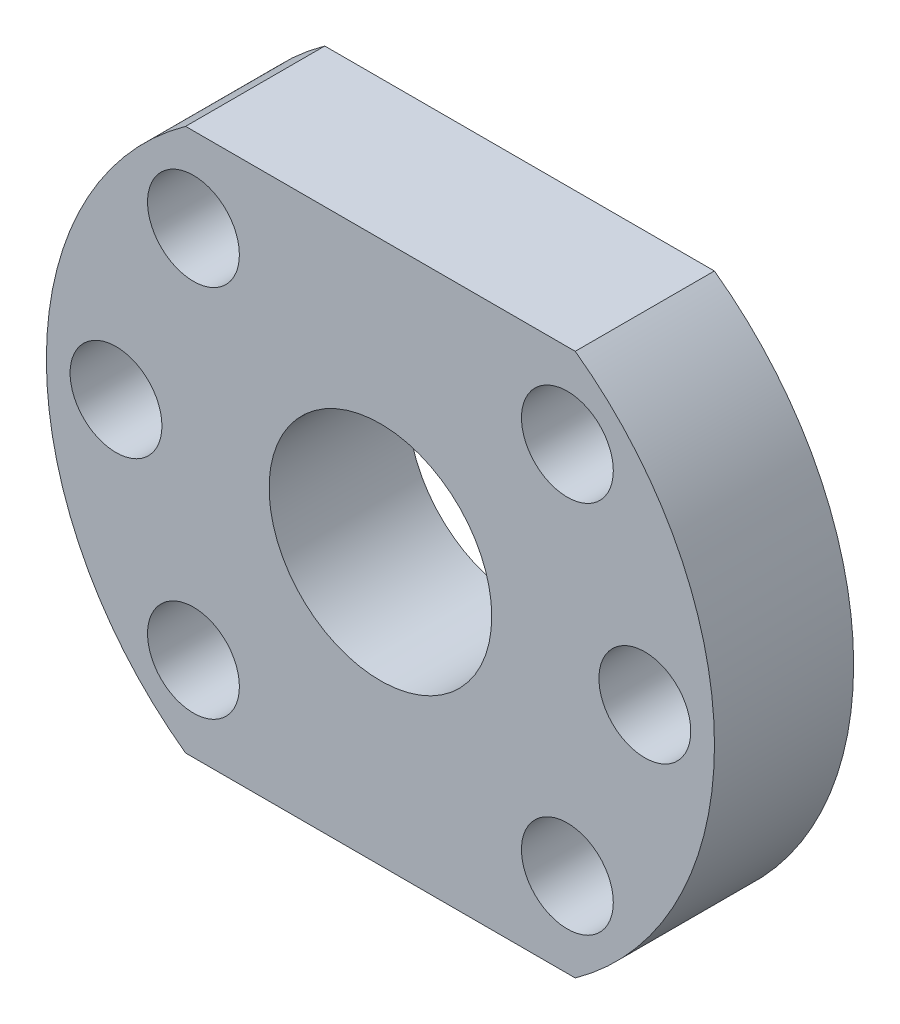
ISO-10303-21;
HEADER;
FILE_DESCRIPTION(('STEP AP214'),'2;1');
FILE_NAME('part.step','',(''),(''),'','','');
FILE_SCHEMA(('AUTOMOTIVE_DESIGN { 1 0 10303 214 1 1 1 1 }'));
ENDSEC;
DATA;
#1=APPLICATION_CONTEXT('core data for automotive mechanical design processes');
#2=APPLICATION_PROTOCOL_DEFINITION('international standard','automotive_design',2000,#1);
#3=PRODUCT_CONTEXT('',#1,'mechanical');
#4=PRODUCT('Part','Part','',(#3));
#5=PRODUCT_RELATED_PRODUCT_CATEGORY('part','',(#4));
#6=PRODUCT_DEFINITION_FORMATION('','',#4);
#7=PRODUCT_DEFINITION_CONTEXT('part definition',#1,'design');
#8=PRODUCT_DEFINITION('design','',#6,#7);
#9=PRODUCT_DEFINITION_SHAPE('','',#8);
#10=(LENGTH_UNIT() NAMED_UNIT(*) SI_UNIT(.MILLI.,.METRE.));
#11=(NAMED_UNIT(*) PLANE_ANGLE_UNIT() SI_UNIT($,.RADIAN.));
#12=(NAMED_UNIT(*) SI_UNIT($,.STERADIAN.) SOLID_ANGLE_UNIT());
#13=UNCERTAINTY_MEASURE_WITH_UNIT(LENGTH_MEASURE(1.E-05),#10,'distance_accuracy_value','');
#14=(GEOMETRIC_REPRESENTATION_CONTEXT(3) GLOBAL_UNCERTAINTY_ASSIGNED_CONTEXT((#13)) GLOBAL_UNIT_ASSIGNED_CONTEXT((#10,
#11,#12)) REPRESENTATION_CONTEXT('',''));
#15=CARTESIAN_POINT('',(0.,0.,0.));
#16=DIRECTION('',(0.,0.,1.));
#17=DIRECTION('',(1.,0.,0.));
#18=AXIS2_PLACEMENT_3D('',#15,#16,#17);
#19=CARTESIAN_POINT('',(0.,0.,10.));
#20=DIRECTION('',(0.,0.,1.));
#21=DIRECTION('',(1.,0.,0.));
#22=AXIS2_PLACEMENT_3D('',#19,#20,#21);
#23=PLANE('',#22);
#24=CARTESIAN_POINT('',(-13.4350288425444,13.4350288425444,10.));
#25=DIRECTION('',(0.,0.,1.));
#26=DIRECTION('',(1.,0.,0.));
#27=AXIS2_PLACEMENT_3D('',#24,#25,#26);
#28=CIRCLE('',#27,3.3);
#29=CARTESIAN_POINT('',(-10.1350288425444,13.4350288425444,10.));
#30=VERTEX_POINT('',#29);
#31=EDGE_CURVE('E181',#30,#30,#28,.T.);
#32=ORIENTED_EDGE('',*,*,#31,.F.);
#33=EDGE_LOOP('',(#32));
#34=FACE_BOUND('',#33,.T.);
#35=CARTESIAN_POINT('',(13.4350288425444,13.4350288425444,10.));
#36=DIRECTION('',(0.,0.,1.));
#37=DIRECTION('',(1.,0.,0.));
#38=AXIS2_PLACEMENT_3D('',#35,#36,#37);
#39=CIRCLE('',#38,3.3);
#40=CARTESIAN_POINT('',(16.7350288425444,13.4350288425444,10.));
#41=VERTEX_POINT('',#40);
#42=EDGE_CURVE('E173',#41,#41,#39,.T.);
#43=ORIENTED_EDGE('',*,*,#42,.F.);
#44=EDGE_LOOP('',(#43));
#45=FACE_BOUND('',#44,.T.);
#46=CARTESIAN_POINT('',(19.,0.,10.));
#47=DIRECTION('',(0.,0.,1.));
#48=DIRECTION('',(1.,0.,0.));
#49=AXIS2_PLACEMENT_3D('',#46,#47,#48);
#50=CIRCLE('',#49,3.3);
#51=CARTESIAN_POINT('',(22.3,0.,10.));
#52=VERTEX_POINT('',#51);
#53=EDGE_CURVE('E165',#52,#52,#50,.T.);
#54=ORIENTED_EDGE('',*,*,#53,.F.);
#55=EDGE_LOOP('',(#54));
#56=FACE_BOUND('',#55,.T.);
#57=CARTESIAN_POINT('',(13.4350288425444,-13.4350288425444,10.));
#58=DIRECTION('',(0.,0.,1.));
#59=DIRECTION('',(1.,0.,0.));
#60=AXIS2_PLACEMENT_3D('',#57,#58,#59);
#61=CIRCLE('',#60,3.3);
#62=CARTESIAN_POINT('',(16.7350288425444,-13.4350288425444,10.));
#63=VERTEX_POINT('',#62);
#64=EDGE_CURVE('E157',#63,#63,#61,.T.);
#65=ORIENTED_EDGE('',*,*,#64,.F.);
#66=EDGE_LOOP('',(#65));
#67=FACE_BOUND('',#66,.T.);
#68=CARTESIAN_POINT('',(-13.4350288425444,-13.4350288425444,10.));
#69=DIRECTION('',(0.,0.,1.));
#70=DIRECTION('',(1.,0.,0.));
#71=AXIS2_PLACEMENT_3D('',#68,#69,#70);
#72=CIRCLE('',#71,3.3);
#73=CARTESIAN_POINT('',(-10.1350288425444,-13.4350288425444,10.));
#74=VERTEX_POINT('',#73);
#75=EDGE_CURVE('E149',#74,#74,#72,.T.);
#76=ORIENTED_EDGE('',*,*,#75,.F.);
#77=EDGE_LOOP('',(#76));
#78=FACE_BOUND('',#77,.T.);
#79=CARTESIAN_POINT('',(-19.,0.,10.));
#80=DIRECTION('',(0.,0.,1.));
#81=DIRECTION('',(1.,0.,0.));
#82=AXIS2_PLACEMENT_3D('',#79,#80,#81);
#83=CIRCLE('',#82,3.3);
#84=CARTESIAN_POINT('',(-15.7,0.,10.));
#85=VERTEX_POINT('',#84);
#86=EDGE_CURVE('E141',#85,#85,#83,.T.);
#87=ORIENTED_EDGE('',*,*,#86,.F.);
#88=EDGE_LOOP('',(#87));
#89=FACE_BOUND('',#88,.T.);
#90=CARTESIAN_POINT('',(0.,0.,10.));
#91=DIRECTION('',(0.,0.,1.));
#92=DIRECTION('',(1.,0.,0.));
#93=AXIS2_PLACEMENT_3D('',#90,#91,#92);
#94=CIRCLE('',#93,24.0052077683156);
#95=CARTESIAN_POINT('',(-14.,19.5,10.));
#96=VERTEX_POINT('',#95);
#97=CARTESIAN_POINT('',(-14.,-19.5,10.));
#98=VERTEX_POINT('',#97);
#99=EDGE_CURVE('E92',#96,#98,#94,.T.);
#100=ORIENTED_EDGE('',*,*,#99,.T.);
#101=DIRECTION('',(1.,0.,0.));
#102=VECTOR('',#101,1.);
#103=CARTESIAN_POINT('',(14.,-19.5,10.));
#104=LINE('',#103,#102);
#105=CARTESIAN_POINT('',(14.,-19.5,10.));
#106=VERTEX_POINT('',#105);
#107=EDGE_CURVE('E87',#98,#106,#104,.T.);
#108=ORIENTED_EDGE('',*,*,#107,.T.);
#109=CARTESIAN_POINT('',(0.,0.,10.));
#110=DIRECTION('',(0.,0.,1.));
#111=DIRECTION('',(1.,0.,0.));
#112=AXIS2_PLACEMENT_3D('',#109,#110,#111);
#113=CIRCLE('',#112,24.0052077683156);
#114=CARTESIAN_POINT('',(14.,19.5,10.));
#115=VERTEX_POINT('',#114);
#116=EDGE_CURVE('E90',#106,#115,#113,.T.);
#117=ORIENTED_EDGE('',*,*,#116,.T.);
#118=DIRECTION('',(-1.,0.,0.));
#119=VECTOR('',#118,1.);
#120=CARTESIAN_POINT('',(-14.,19.5,10.));
#121=LINE('',#120,#119);
#122=EDGE_CURVE('E57',#115,#96,#121,.T.);
#123=ORIENTED_EDGE('',*,*,#122,.T.);
#124=EDGE_LOOP('',(#100,#108,#117,#123));
#125=FACE_BOUND('',#124,.T.);
#126=CARTESIAN_POINT('',(0.,0.,10.));
#127=DIRECTION('',(0.,0.,1.));
#128=DIRECTION('',(1.,0.,0.));
#129=AXIS2_PLACEMENT_3D('',#126,#127,#128);
#130=CIRCLE('',#129,8.);
#131=CARTESIAN_POINT('',(8.,0.,10.));
#132=VERTEX_POINT('',#131);
#133=EDGE_CURVE('E112',#132,#132,#130,.T.);
#134=ORIENTED_EDGE('',*,*,#133,.F.);
#135=EDGE_LOOP('',(#134));
#136=FACE_BOUND('',#135,.T.);
#137=ADVANCED_FACE('F39',(#34,#45,#56,#67,#78,#89,#125,#136),#23,.T.);
#138=CARTESIAN_POINT('',(0.,0.,0.));
#139=DIRECTION('',(0.,0.,1.));
#140=DIRECTION('',(1.,0.,0.));
#141=AXIS2_PLACEMENT_3D('',#138,#139,#140);
#142=PLANE('',#141);
#143=CARTESIAN_POINT('',(-13.4350288425444,13.4350288425444,0.));
#144=DIRECTION('',(0.,0.,1.));
#145=DIRECTION('',(1.,0.,0.));
#146=AXIS2_PLACEMENT_3D('',#143,#144,#145);
#147=CIRCLE('',#146,3.3);
#148=CARTESIAN_POINT('',(-10.1350288425444,13.4350288425444,0.));
#149=VERTEX_POINT('',#148);
#150=EDGE_CURVE('E177',#149,#149,#147,.T.);
#151=ORIENTED_EDGE('',*,*,#150,.T.);
#152=EDGE_LOOP('',(#151));
#153=FACE_BOUND('',#152,.T.);
#154=CARTESIAN_POINT('',(13.4350288425444,13.4350288425444,0.));
#155=DIRECTION('',(0.,0.,1.));
#156=DIRECTION('',(1.,0.,0.));
#157=AXIS2_PLACEMENT_3D('',#154,#155,#156);
#158=CIRCLE('',#157,3.3);
#159=CARTESIAN_POINT('',(16.7350288425444,13.4350288425444,0.));
#160=VERTEX_POINT('',#159);
#161=EDGE_CURVE('E169',#160,#160,#158,.T.);
#162=ORIENTED_EDGE('',*,*,#161,.T.);
#163=EDGE_LOOP('',(#162));
#164=FACE_BOUND('',#163,.T.);
#165=CARTESIAN_POINT('',(19.,0.,0.));
#166=DIRECTION('',(0.,0.,1.));
#167=DIRECTION('',(1.,0.,0.));
#168=AXIS2_PLACEMENT_3D('',#165,#166,#167);
#169=CIRCLE('',#168,3.3);
#170=CARTESIAN_POINT('',(22.3,0.,0.));
#171=VERTEX_POINT('',#170);
#172=EDGE_CURVE('E161',#171,#171,#169,.T.);
#173=ORIENTED_EDGE('',*,*,#172,.T.);
#174=EDGE_LOOP('',(#173));
#175=FACE_BOUND('',#174,.T.);
#176=CARTESIAN_POINT('',(13.4350288425444,-13.4350288425444,0.));
#177=DIRECTION('',(0.,0.,1.));
#178=DIRECTION('',(1.,0.,0.));
#179=AXIS2_PLACEMENT_3D('',#176,#177,#178);
#180=CIRCLE('',#179,3.3);
#181=CARTESIAN_POINT('',(16.7350288425444,-13.4350288425444,0.));
#182=VERTEX_POINT('',#181);
#183=EDGE_CURVE('E153',#182,#182,#180,.T.);
#184=ORIENTED_EDGE('',*,*,#183,.T.);
#185=EDGE_LOOP('',(#184));
#186=FACE_BOUND('',#185,.T.);
#187=CARTESIAN_POINT('',(-13.4350288425444,-13.4350288425444,0.));
#188=DIRECTION('',(0.,0.,1.));
#189=DIRECTION('',(1.,0.,0.));
#190=AXIS2_PLACEMENT_3D('',#187,#188,#189);
#191=CIRCLE('',#190,3.3);
#192=CARTESIAN_POINT('',(-10.1350288425444,-13.4350288425444,0.));
#193=VERTEX_POINT('',#192);
#194=EDGE_CURVE('E145',#193,#193,#191,.T.);
#195=ORIENTED_EDGE('',*,*,#194,.T.);
#196=EDGE_LOOP('',(#195));
#197=FACE_BOUND('',#196,.T.);
#198=CARTESIAN_POINT('',(-19.,0.,0.));
#199=DIRECTION('',(0.,0.,1.));
#200=DIRECTION('',(1.,0.,0.));
#201=AXIS2_PLACEMENT_3D('',#198,#199,#200);
#202=CIRCLE('',#201,3.3);
#203=CARTESIAN_POINT('',(-15.7,0.,0.));
#204=VERTEX_POINT('',#203);
#205=EDGE_CURVE('E134',#204,#204,#202,.T.);
#206=ORIENTED_EDGE('',*,*,#205,.T.);
#207=EDGE_LOOP('',(#206));
#208=FACE_BOUND('',#207,.T.);
#209=CARTESIAN_POINT('',(0.,0.,0.));
#210=DIRECTION('',(0.,0.,1.));
#211=DIRECTION('',(1.,0.,0.));
#212=AXIS2_PLACEMENT_3D('',#209,#210,#211);
#213=CIRCLE('',#212,24.0052077683156);
#214=CARTESIAN_POINT('',(-14.,19.5,0.));
#215=VERTEX_POINT('',#214);
#216=CARTESIAN_POINT('',(-14.,-19.5,0.));
#217=VERTEX_POINT('',#216);
#218=EDGE_CURVE('E108',#215,#217,#213,.T.);
#219=ORIENTED_EDGE('',*,*,#218,.F.);
#220=DIRECTION('',(-1.,0.,0.));
#221=VECTOR('',#220,1.);
#222=CARTESIAN_POINT('',(-14.,19.5,0.));
#223=LINE('',#222,#221);
#224=CARTESIAN_POINT('',(14.,19.5,0.));
#225=VERTEX_POINT('',#224);
#226=EDGE_CURVE('E80',#225,#215,#223,.T.);
#227=ORIENTED_EDGE('',*,*,#226,.F.);
#228=CARTESIAN_POINT('',(0.,0.,0.));
#229=DIRECTION('',(0.,0.,1.));
#230=DIRECTION('',(1.,0.,0.));
#231=AXIS2_PLACEMENT_3D('',#228,#229,#230);
#232=CIRCLE('',#231,24.0052077683156);
#233=CARTESIAN_POINT('',(14.,-19.5,0.));
#234=VERTEX_POINT('',#233);
#235=EDGE_CURVE('E74',#234,#225,#232,.T.);
#236=ORIENTED_EDGE('',*,*,#235,.F.);
#237=DIRECTION('',(1.,0.,0.));
#238=VECTOR('',#237,1.);
#239=CARTESIAN_POINT('',(14.,-19.5,0.));
#240=LINE('',#239,#238);
#241=EDGE_CURVE('E97',#217,#234,#240,.T.);
#242=ORIENTED_EDGE('',*,*,#241,.F.);
#243=EDGE_LOOP('',(#219,#227,#236,#242));
#244=FACE_BOUND('',#243,.T.);
#245=CARTESIAN_POINT('',(0.,0.,0.));
#246=DIRECTION('',(0.,0.,1.));
#247=DIRECTION('',(1.,0.,0.));
#248=AXIS2_PLACEMENT_3D('',#245,#246,#247);
#249=CIRCLE('',#248,8.);
#250=CARTESIAN_POINT('',(8.,0.,0.));
#251=VERTEX_POINT('',#250);
#252=EDGE_CURVE('E130',#251,#251,#249,.T.);
#253=ORIENTED_EDGE('',*,*,#252,.T.);
#254=EDGE_LOOP('',(#253));
#255=FACE_BOUND('',#254,.T.);
#256=ADVANCED_FACE('F125',(#153,#164,#175,#186,#197,#208,#244,#255),#142,.F.);
#257=CARTESIAN_POINT('',(0.,0.,10.));
#258=DIRECTION('',(0.,0.,-1.));
#259=DIRECTION('',(-1.,0.,0.));
#260=AXIS2_PLACEMENT_3D('',#257,#258,#259);
#261=CYLINDRICAL_SURFACE('',#260,24.0052077683156);
#262=ORIENTED_EDGE('',*,*,#218,.T.);
#263=DIRECTION('',(0.,0.,-1.));
#264=VECTOR('',#263,1.);
#265=CARTESIAN_POINT('',(-14.,-19.5,10.));
#266=LINE('',#265,#264);
#267=EDGE_CURVE('E11',#98,#217,#266,.T.);
#268=ORIENTED_EDGE('',*,*,#267,.F.);
#269=ORIENTED_EDGE('',*,*,#99,.F.);
#270=DIRECTION('',(0.,0.,-1.));
#271=VECTOR('',#270,1.);
#272=CARTESIAN_POINT('',(-14.,19.5,10.));
#273=LINE('',#272,#271);
#274=EDGE_CURVE('E104',#96,#215,#273,.T.);
#275=ORIENTED_EDGE('',*,*,#274,.T.);
#276=EDGE_LOOP('',(#262,#268,#269,#275));
#277=FACE_BOUND('',#276,.T.);
#278=ADVANCED_FACE('F41',(#277),#261,.T.);
#279=CARTESIAN_POINT('',(14.,-19.5,10.));
#280=DIRECTION('',(0.,1.,0.));
#281=DIRECTION('',(0.,0.,1.));
#282=AXIS2_PLACEMENT_3D('',#279,#280,#281);
#283=PLANE('',#282);
#284=ORIENTED_EDGE('',*,*,#241,.T.);
#285=DIRECTION('',(0.,0.,-1.));
#286=VECTOR('',#285,1.);
#287=CARTESIAN_POINT('',(14.,-19.5,10.));
#288=LINE('',#287,#286);
#289=EDGE_CURVE('E49',#106,#234,#288,.T.);
#290=ORIENTED_EDGE('',*,*,#289,.F.);
#291=ORIENTED_EDGE('',*,*,#107,.F.);
#292=ORIENTED_EDGE('',*,*,#267,.T.);
#293=EDGE_LOOP('',(#284,#290,#291,#292));
#294=FACE_BOUND('',#293,.T.);
#295=ADVANCED_FACE('F96',(#294),#283,.F.);
#296=CARTESIAN_POINT('',(0.,0.,10.));
#297=DIRECTION('',(0.,0.,-1.));
#298=DIRECTION('',(-1.,0.,0.));
#299=AXIS2_PLACEMENT_3D('',#296,#297,#298);
#300=CYLINDRICAL_SURFACE('',#299,24.0052077683156);
#301=ORIENTED_EDGE('',*,*,#235,.T.);
#302=DIRECTION('',(0.,0.,-1.));
#303=VECTOR('',#302,1.);
#304=CARTESIAN_POINT('',(14.,19.5,10.));
#305=LINE('',#304,#303);
#306=EDGE_CURVE('E99',#115,#225,#305,.T.);
#307=ORIENTED_EDGE('',*,*,#306,.F.);
#308=ORIENTED_EDGE('',*,*,#116,.F.);
#309=ORIENTED_EDGE('',*,*,#289,.T.);
#310=EDGE_LOOP('',(#301,#307,#308,#309));
#311=FACE_BOUND('',#310,.T.);
#312=ADVANCED_FACE('F100',(#311),#300,.T.);
#313=CARTESIAN_POINT('',(-14.,19.5,10.));
#314=DIRECTION('',(0.,-1.,0.));
#315=DIRECTION('',(0.,0.,-1.));
#316=AXIS2_PLACEMENT_3D('',#313,#314,#315);
#317=PLANE('',#316);
#318=ORIENTED_EDGE('',*,*,#226,.T.);
#319=ORIENTED_EDGE('',*,*,#274,.F.);
#320=ORIENTED_EDGE('',*,*,#122,.F.);
#321=ORIENTED_EDGE('',*,*,#306,.T.);
#322=EDGE_LOOP('',(#318,#319,#320,#321));
#323=FACE_BOUND('',#322,.T.);
#324=ADVANCED_FACE('F122',(#323),#317,.F.);
#325=CARTESIAN_POINT('',(0.,0.,10.));
#326=DIRECTION('',(0.,0.,-1.));
#327=DIRECTION('',(-1.,0.,0.));
#328=AXIS2_PLACEMENT_3D('',#325,#326,#327);
#329=CYLINDRICAL_SURFACE('',#328,8.);
#330=ORIENTED_EDGE('',*,*,#133,.T.);
#331=EDGE_LOOP('',(#330));
#332=FACE_BOUND('',#331,.T.);
#333=ORIENTED_EDGE('',*,*,#252,.F.);
#334=EDGE_LOOP('',(#333));
#335=FACE_BOUND('',#334,.T.);
#336=ADVANCED_FACE('F204',(#332,#335),#329,.F.);
#337=CARTESIAN_POINT('',(-19.,0.,10.));
#338=DIRECTION('',(0.,0.,1.));
#339=DIRECTION('',(1.,0.,0.));
#340=AXIS2_PLACEMENT_3D('',#337,#338,#339);
#341=CYLINDRICAL_SURFACE('',#340,3.3);
#342=ORIENTED_EDGE('',*,*,#205,.F.);
#343=EDGE_LOOP('',(#342));
#344=FACE_BOUND('',#343,.T.);
#345=ORIENTED_EDGE('',*,*,#86,.T.);
#346=EDGE_LOOP('',(#345));
#347=FACE_BOUND('',#346,.T.);
#348=ADVANCED_FACE('F201',(#344,#347),#341,.F.);
#349=CARTESIAN_POINT('',(-13.4350288425444,-13.4350288425444,10.));
#350=DIRECTION('',(0.,0.,1.));
#351=DIRECTION('',(1.,0.,0.));
#352=AXIS2_PLACEMENT_3D('',#349,#350,#351);
#353=CYLINDRICAL_SURFACE('',#352,3.3);
#354=ORIENTED_EDGE('',*,*,#194,.F.);
#355=EDGE_LOOP('',(#354));
#356=FACE_BOUND('',#355,.T.);
#357=ORIENTED_EDGE('',*,*,#75,.T.);
#358=EDGE_LOOP('',(#357));
#359=FACE_BOUND('',#358,.T.);
#360=ADVANCED_FACE('F203',(#356,#359),#353,.F.);
#361=CARTESIAN_POINT('',(13.4350288425444,-13.4350288425444,10.));
#362=DIRECTION('',(0.,0.,1.));
#363=DIRECTION('',(1.,0.,0.));
#364=AXIS2_PLACEMENT_3D('',#361,#362,#363);
#365=CYLINDRICAL_SURFACE('',#364,3.3);
#366=ORIENTED_EDGE('',*,*,#183,.F.);
#367=EDGE_LOOP('',(#366));
#368=FACE_BOUND('',#367,.T.);
#369=ORIENTED_EDGE('',*,*,#64,.T.);
#370=EDGE_LOOP('',(#369));
#371=FACE_BOUND('',#370,.T.);
#372=ADVANCED_FACE('F211',(#368,#371),#365,.F.);
#373=CARTESIAN_POINT('',(19.,0.,10.));
#374=DIRECTION('',(0.,0.,1.));
#375=DIRECTION('',(1.,0.,0.));
#376=AXIS2_PLACEMENT_3D('',#373,#374,#375);
#377=CYLINDRICAL_SURFACE('',#376,3.3);
#378=ORIENTED_EDGE('',*,*,#172,.F.);
#379=EDGE_LOOP('',(#378));
#380=FACE_BOUND('',#379,.T.);
#381=ORIENTED_EDGE('',*,*,#53,.T.);
#382=EDGE_LOOP('',(#381));
#383=FACE_BOUND('',#382,.T.);
#384=ADVANCED_FACE('F284',(#380,#383),#377,.F.);
#385=CARTESIAN_POINT('',(13.4350288425444,13.4350288425444,10.));
#386=DIRECTION('',(0.,0.,1.));
#387=DIRECTION('',(1.,0.,0.));
#388=AXIS2_PLACEMENT_3D('',#385,#386,#387);
#389=CYLINDRICAL_SURFACE('',#388,3.3);
#390=ORIENTED_EDGE('',*,*,#161,.F.);
#391=EDGE_LOOP('',(#390));
#392=FACE_BOUND('',#391,.T.);
#393=ORIENTED_EDGE('',*,*,#42,.T.);
#394=EDGE_LOOP('',(#393));
#395=FACE_BOUND('',#394,.T.);
#396=ADVANCED_FACE('F292',(#392,#395),#389,.F.);
#397=CARTESIAN_POINT('',(-13.4350288425444,13.4350288425444,10.));
#398=DIRECTION('',(0.,0.,1.));
#399=DIRECTION('',(1.,0.,0.));
#400=AXIS2_PLACEMENT_3D('',#397,#398,#399);
#401=CYLINDRICAL_SURFACE('',#400,3.3);
#402=ORIENTED_EDGE('',*,*,#150,.F.);
#403=EDGE_LOOP('',(#402));
#404=FACE_BOUND('',#403,.T.);
#405=ORIENTED_EDGE('',*,*,#31,.T.);
#406=EDGE_LOOP('',(#405));
#407=FACE_BOUND('',#406,.T.);
#408=ADVANCED_FACE('F186',(#404,#407),#401,.F.);
#409=CLOSED_SHELL('',(#137,#256,#278,#295,#312,#324,#336,#348,#360,#372,#384,#396,#408));
#410=MANIFOLD_SOLID_BREP('B2',#409);
#411=ADVANCED_BREP_SHAPE_REPRESENTATION('',(#18,#410),#14);
#412=SHAPE_DEFINITION_REPRESENTATION(#9,#411);
ENDSEC;
END-ISO-10303-21;
